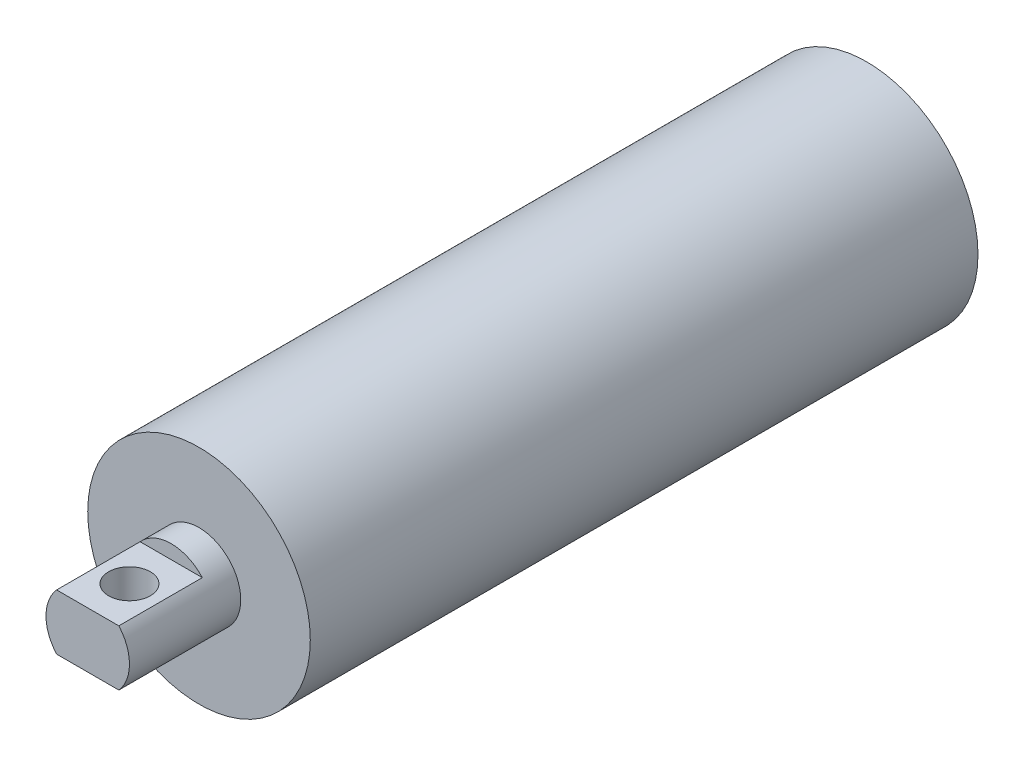
ISO-10303-21;
HEADER;
FILE_DESCRIPTION(('STEP AP214'),'2;1');
FILE_NAME('part.step','',(''),(''),'','','');
FILE_SCHEMA(('AUTOMOTIVE_DESIGN { 1 0 10303 214 1 1 1 1 }'));
ENDSEC;
DATA;
#1=APPLICATION_CONTEXT('core data for automotive mechanical design processes');
#2=APPLICATION_PROTOCOL_DEFINITION('international standard','automotive_design',2000,#1);
#3=PRODUCT_CONTEXT('',#1,'mechanical');
#4=PRODUCT('Part','Part','',(#3));
#5=PRODUCT_RELATED_PRODUCT_CATEGORY('part','',(#4));
#6=PRODUCT_DEFINITION_FORMATION('','',#4);
#7=PRODUCT_DEFINITION_CONTEXT('part definition',#1,'design');
#8=PRODUCT_DEFINITION('design','',#6,#7);
#9=PRODUCT_DEFINITION_SHAPE('','',#8);
#10=(LENGTH_UNIT() NAMED_UNIT(*) SI_UNIT(.MILLI.,.METRE.));
#11=(NAMED_UNIT(*) PLANE_ANGLE_UNIT() SI_UNIT($,.RADIAN.));
#12=(NAMED_UNIT(*) SI_UNIT($,.STERADIAN.) SOLID_ANGLE_UNIT());
#13=UNCERTAINTY_MEASURE_WITH_UNIT(LENGTH_MEASURE(1.E-05),#10,'distance_accuracy_value','');
#14=(GEOMETRIC_REPRESENTATION_CONTEXT(3) GLOBAL_UNCERTAINTY_ASSIGNED_CONTEXT((#13)) GLOBAL_UNIT_ASSIGNED_CONTEXT((#10,
#11,#12)) REPRESENTATION_CONTEXT('',''));
#15=CARTESIAN_POINT('',(0.,0.,0.));
#16=DIRECTION('',(0.,0.,1.));
#17=DIRECTION('',(1.,0.,0.));
#18=AXIS2_PLACEMENT_3D('',#15,#16,#17);
#19=CARTESIAN_POINT('',(0.,0.,152.4));
#20=DIRECTION('',(0.,0.,-1.));
#21=DIRECTION('',(-1.,0.,0.));
#22=AXIS2_PLACEMENT_3D('',#19,#20,#21);
#23=CYLINDRICAL_SURFACE('',#22,25.4);
#24=CARTESIAN_POINT('',(0.,0.,152.4));
#25=DIRECTION('',(0.,0.,1.));
#26=DIRECTION('',(1.,0.,0.));
#27=AXIS2_PLACEMENT_3D('',#24,#25,#26);
#28=CIRCLE('',#27,25.4);
#29=CARTESIAN_POINT('',(-25.4,0.,152.4));
#30=VERTEX_POINT('',#29);
#31=EDGE_CURVE('E114',#30,#30,#28,.T.);
#32=CARTESIAN_POINT('',(0.,0.,0.));
#33=DIRECTION('',(0.,0.,1.));
#34=DIRECTION('',(1.,0.,0.));
#35=AXIS2_PLACEMENT_3D('',#32,#33,#34);
#36=CIRCLE('',#35,25.4);
#37=CARTESIAN_POINT('',(-25.4,0.,0.));
#38=VERTEX_POINT('',#37);
#39=EDGE_CURVE('E108',#38,#38,#36,.T.);
#40=CARTESIAN_POINT('',(-25.4,0.,152.4));
#41=CARTESIAN_POINT('',(-25.4,0.,150.8125));
#42=CARTESIAN_POINT('',(-25.4,0.,149.225));
#43=CARTESIAN_POINT('',(-25.4,0.,146.05));
#44=CARTESIAN_POINT('',(-25.4,0.,144.4625));
#45=CARTESIAN_POINT('',(-25.4,0.,141.2875));
#46=CARTESIAN_POINT('',(-25.4,0.,139.7));
#47=CARTESIAN_POINT('',(-25.4,0.,136.525));
#48=CARTESIAN_POINT('',(-25.4,0.,134.9375));
#49=CARTESIAN_POINT('',(-25.4,0.,131.7625));
#50=CARTESIAN_POINT('',(-25.4,0.,130.175));
#51=CARTESIAN_POINT('',(-25.4,0.,127.));
#52=CARTESIAN_POINT('',(-25.4,0.,125.4125));
#53=CARTESIAN_POINT('',(-25.4,0.,122.2375));
#54=CARTESIAN_POINT('',(-25.4,0.,120.65));
#55=CARTESIAN_POINT('',(-25.4,0.,117.475));
#56=CARTESIAN_POINT('',(-25.4,0.,115.8875));
#57=CARTESIAN_POINT('',(-25.4,0.,112.7125));
#58=CARTESIAN_POINT('',(-25.4,0.,111.125));
#59=CARTESIAN_POINT('',(-25.4,0.,107.95));
#60=CARTESIAN_POINT('',(-25.4,0.,106.3625));
#61=CARTESIAN_POINT('',(-25.4,0.,103.1875));
#62=CARTESIAN_POINT('',(-25.4,0.,101.6));
#63=CARTESIAN_POINT('',(-25.4,0.,98.425));
#64=CARTESIAN_POINT('',(-25.4,0.,96.8375));
#65=CARTESIAN_POINT('',(-25.4,0.,93.6625));
#66=CARTESIAN_POINT('',(-25.4,0.,92.075));
#67=CARTESIAN_POINT('',(-25.4,0.,88.9));
#68=CARTESIAN_POINT('',(-25.4,0.,87.3125));
#69=CARTESIAN_POINT('',(-25.4,0.,84.1375));
#70=CARTESIAN_POINT('',(-25.4,0.,82.55));
#71=CARTESIAN_POINT('',(-25.4,0.,79.375));
#72=CARTESIAN_POINT('',(-25.4,0.,77.7875));
#73=CARTESIAN_POINT('',(-25.4,0.,74.6125));
#74=CARTESIAN_POINT('',(-25.4,0.,73.025));
#75=CARTESIAN_POINT('',(-25.4,0.,69.85));
#76=CARTESIAN_POINT('',(-25.4,0.,68.2625));
#77=CARTESIAN_POINT('',(-25.4,0.,65.0875));
#78=CARTESIAN_POINT('',(-25.4,0.,63.5));
#79=CARTESIAN_POINT('',(-25.4,0.,60.325));
#80=CARTESIAN_POINT('',(-25.4,0.,58.7375));
#81=CARTESIAN_POINT('',(-25.4,0.,55.5625));
#82=CARTESIAN_POINT('',(-25.4,0.,53.975));
#83=CARTESIAN_POINT('',(-25.4,0.,50.8));
#84=CARTESIAN_POINT('',(-25.4,0.,49.2125));
#85=CARTESIAN_POINT('',(-25.4,0.,46.0375));
#86=CARTESIAN_POINT('',(-25.4,0.,44.45));
#87=CARTESIAN_POINT('',(-25.4,0.,41.275));
#88=CARTESIAN_POINT('',(-25.4,0.,39.6875));
#89=CARTESIAN_POINT('',(-25.4,0.,36.5125));
#90=CARTESIAN_POINT('',(-25.4,0.,34.925));
#91=CARTESIAN_POINT('',(-25.4,0.,31.75));
#92=CARTESIAN_POINT('',(-25.4,0.,30.1625));
#93=CARTESIAN_POINT('',(-25.4,0.,26.9875));
#94=CARTESIAN_POINT('',(-25.4,0.,25.4));
#95=CARTESIAN_POINT('',(-25.4,0.,22.225));
#96=CARTESIAN_POINT('',(-25.4,0.,20.6375));
#97=CARTESIAN_POINT('',(-25.4,0.,17.4625));
#98=CARTESIAN_POINT('',(-25.4,0.,15.875));
#99=CARTESIAN_POINT('',(-25.4,0.,12.7));
#100=CARTESIAN_POINT('',(-25.4,0.,11.1125));
#101=CARTESIAN_POINT('',(-25.4,0.,7.93750000000001));
#102=CARTESIAN_POINT('',(-25.4,0.,6.35));
#103=CARTESIAN_POINT('',(-25.4,0.,3.175));
#104=CARTESIAN_POINT('',(-25.4,0.,1.5875));
#105=CARTESIAN_POINT('',(-25.4,0.,0.));
#106=B_SPLINE_CURVE_WITH_KNOTS('',3,(#40,#41,#42,#43,#44,#45,#46,#47,#48,#49,#50,#51,#52,#53,
#54,#55,#56,#57,#58,#59,#60,#61,#62,#63,#64,#65,#66,#67,#68,#69,#70,#71,#72,#73,#74,#75,#76,#77,
#78,#79,#80,#81,#82,#83,#84,#85,#86,#87,#88,#89,#90,#91,#92,#93,#94,#95,#96,#97,#98,#99,#100,
#101,#102,#103,#104,#105),.UNSPECIFIED.,.F.,.F.,(4,2,2,2,2,2,2,2,2,2,2,2,2,2,2,2,2,2,2,2,2,2,2,
2,2,2,2,2,2,2,2,2,4),(0.,4.76249999999998,9.52499999999998,14.2875,19.05,23.8125,28.575,33.3375,
38.1,42.8625,47.625,52.3875,57.15,61.9125,66.675,71.4375,76.2,80.9625,85.725,90.4875,95.25,
100.0125,104.775,109.5375,114.3,119.0625,123.825,128.5875,133.35,138.1125,142.875,147.6375,
152.4),.UNSPECIFIED.);
#107=EDGE_CURVE('BSEAM43',#30,#38,#106,.T.);
#108=ORIENTED_EDGE('',*,*,#31,.F.);
#109=ORIENTED_EDGE('',*,*,#39,.T.);
#110=ORIENTED_EDGE('',*,*,#107,.T.);
#111=ORIENTED_EDGE('',*,*,#107,.F.);
#112=EDGE_LOOP('',(#108,#110,#109,#111));
#113=FACE_BOUND('',#112,.T.);
#114=ADVANCED_FACE('F43',(#113),#23,.T.);
#115=CARTESIAN_POINT('',(0.,0.,152.4));
#116=DIRECTION('',(0.,0.,1.));
#117=DIRECTION('',(1.,0.,0.));
#118=AXIS2_PLACEMENT_3D('',#115,#116,#117);
#119=PLANE('',#118);
#120=CARTESIAN_POINT('',(0.,0.,152.4));
#121=DIRECTION('',(0.,0.,1.));
#122=DIRECTION('',(1.,0.,0.));
#123=AXIS2_PLACEMENT_3D('',#120,#121,#122);
#124=CIRCLE('',#123,9.525);
#125=CARTESIAN_POINT('',(9.525,0.,152.4));
#126=VERTEX_POINT('',#125);
#127=EDGE_CURVE('E95',#126,#126,#124,.T.);
#128=ORIENTED_EDGE('',*,*,#127,.F.);
#129=EDGE_LOOP('',(#128));
#130=FACE_BOUND('',#129,.T.);
#131=ORIENTED_EDGE('',*,*,#31,.T.);
#132=EDGE_LOOP('',(#131));
#133=FACE_BOUND('',#132,.T.);
#134=ADVANCED_FACE('F153',(#130,#133),#119,.T.);
#135=CARTESIAN_POINT('',(0.,0.,0.));
#136=DIRECTION('',(0.,0.,1.));
#137=DIRECTION('',(1.,0.,0.));
#138=AXIS2_PLACEMENT_3D('',#135,#136,#137);
#139=PLANE('',#138);
#140=CARTESIAN_POINT('',(0.,0.,0.));
#141=DIRECTION('',(0.,0.,-1.));
#142=DIRECTION('',(-1.,0.,0.));
#143=AXIS2_PLACEMENT_3D('',#140,#141,#142);
#144=CIRCLE('',#143,6.35);
#145=CARTESIAN_POINT('',(-6.35,0.,0.));
#146=VERTEX_POINT('',#145);
#147=EDGE_CURVE('E119',#146,#146,#144,.T.);
#148=ORIENTED_EDGE('',*,*,#147,.F.);
#149=EDGE_LOOP('',(#148));
#150=FACE_BOUND('',#149,.T.);
#151=ORIENTED_EDGE('',*,*,#39,.F.);
#152=EDGE_LOOP('',(#151));
#153=FACE_BOUND('',#152,.T.);
#154=ADVANCED_FACE('F150',(#150,#153),#139,.F.);
#155=CARTESIAN_POINT('',(0.,0.,177.8));
#156=DIRECTION('',(0.,0.,-1.));
#157=DIRECTION('',(-1.,0.,0.));
#158=AXIS2_PLACEMENT_3D('',#155,#156,#157);
#159=CYLINDRICAL_SURFACE('',#158,9.525);
#160=CARTESIAN_POINT('',(0.,0.,177.8));
#161=DIRECTION('',(0.,0.,1.));
#162=DIRECTION('',(1.,0.,0.));
#163=AXIS2_PLACEMENT_3D('',#160,#161,#162);
#164=CIRCLE('',#163,9.525);
#165=CARTESIAN_POINT('',(-7.09951582856183,6.35,177.8));
#166=VERTEX_POINT('',#165);
#167=CARTESIAN_POINT('',(-7.09951582856183,-6.35,177.8));
#168=VERTEX_POINT('',#167);
#169=EDGE_CURVE('E102',#166,#168,#164,.T.);
#170=ORIENTED_EDGE('',*,*,#169,.F.);
#171=DIRECTION('',(0.,0.,-1.));
#172=VECTOR('',#171,1.);
#173=CARTESIAN_POINT('',(-7.09951582856183,6.35,177.8));
#174=LINE('',#173,#172);
#175=CARTESIAN_POINT('',(-7.09951582856183,6.35,158.75));
#176=VERTEX_POINT('',#175);
#177=EDGE_CURVE('E67',#166,#176,#174,.T.);
#178=ORIENTED_EDGE('',*,*,#177,.T.);
#179=CARTESIAN_POINT('',(0.,0.,158.75));
#180=DIRECTION('',(0.,0.,-1.));
#181=DIRECTION('',(-1.,0.,0.));
#182=AXIS2_PLACEMENT_3D('',#179,#180,#181);
#183=CIRCLE('',#182,9.525);
#184=CARTESIAN_POINT('',(7.09951582856183,6.35,158.75));
#185=VERTEX_POINT('',#184);
#186=EDGE_CURVE('E11',#176,#185,#183,.T.);
#187=ORIENTED_EDGE('',*,*,#186,.T.);
#188=DIRECTION('',(0.,0.,-1.));
#189=VECTOR('',#188,1.);
#190=CARTESIAN_POINT('',(7.09951582856183,6.35,177.8));
#191=LINE('',#190,#189);
#192=CARTESIAN_POINT('',(7.09951582856183,6.35,177.8));
#193=VERTEX_POINT('',#192);
#194=EDGE_CURVE('E132',#185,#193,#191,.F.);
#195=ORIENTED_EDGE('',*,*,#194,.T.);
#196=CARTESIAN_POINT('',(7.09951582856183,-6.35,177.8));
#197=VERTEX_POINT('',#196);
#198=EDGE_CURVE('E109',#197,#193,#164,.T.);
#199=ORIENTED_EDGE('',*,*,#198,.F.);
#200=DIRECTION('',(0.,0.,-1.));
#201=VECTOR('',#200,1.);
#202=CARTESIAN_POINT('',(7.09951582856183,-6.35,177.8));
#203=LINE('',#202,#201);
#204=CARTESIAN_POINT('',(7.09951582856183,-6.35,158.75));
#205=VERTEX_POINT('',#204);
#206=EDGE_CURVE('E59',#197,#205,#203,.T.);
#207=ORIENTED_EDGE('',*,*,#206,.T.);
#208=CARTESIAN_POINT('',(0.,0.,158.75));
#209=DIRECTION('',(0.,0.,-1.));
#210=DIRECTION('',(-1.,0.,0.));
#211=AXIS2_PLACEMENT_3D('',#208,#209,#210);
#212=CIRCLE('',#211,9.525);
#213=CARTESIAN_POINT('',(-7.09951582856183,-6.35,158.75));
#214=VERTEX_POINT('',#213);
#215=EDGE_CURVE('E52',#205,#214,#212,.T.);
#216=ORIENTED_EDGE('',*,*,#215,.T.);
#217=DIRECTION('',(0.,0.,-1.));
#218=VECTOR('',#217,1.);
#219=CARTESIAN_POINT('',(-7.09951582856183,-6.35,177.8));
#220=LINE('',#219,#218);
#221=EDGE_CURVE('E87',#214,#168,#220,.F.);
#222=ORIENTED_EDGE('',*,*,#221,.T.);
#223=EDGE_LOOP('',(#170,#178,#187,#195,#199,#207,#216,#222));
#224=FACE_BOUND('',#223,.T.);
#225=ORIENTED_EDGE('',*,*,#127,.T.);
#226=EDGE_LOOP('',(#225));
#227=FACE_BOUND('',#226,.T.);
#228=ADVANCED_FACE('F100',(#224,#227),#159,.T.);
#229=CARTESIAN_POINT('',(0.,0.,177.8));
#230=DIRECTION('',(0.,0.,1.));
#231=DIRECTION('',(1.,0.,0.));
#232=AXIS2_PLACEMENT_3D('',#229,#230,#231);
#233=PLANE('',#232);
#234=DIRECTION('',(1.,0.,0.));
#235=VECTOR('',#234,1.);
#236=CARTESIAN_POINT('',(0.,6.35,177.8));
#237=LINE('',#236,#235);
#238=EDGE_CURVE('E94',#166,#193,#237,.T.);
#239=ORIENTED_EDGE('',*,*,#238,.F.);
#240=ORIENTED_EDGE('',*,*,#169,.T.);
#241=DIRECTION('',(-1.,0.,0.));
#242=VECTOR('',#241,1.);
#243=CARTESIAN_POINT('',(0.,-6.35,177.8));
#244=LINE('',#243,#242);
#245=EDGE_CURVE('E84',#197,#168,#244,.T.);
#246=ORIENTED_EDGE('',*,*,#245,.F.);
#247=ORIENTED_EDGE('',*,*,#198,.T.);
#248=EDGE_LOOP('',(#239,#240,#246,#247));
#249=FACE_BOUND('',#248,.T.);
#250=ADVANCED_FACE('F106',(#249),#233,.T.);
#251=CARTESIAN_POINT('',(0.,0.,100.33));
#252=DIRECTION('',(0.,0.,-1.));
#253=DIRECTION('',(-1.,0.,0.));
#254=AXIS2_PLACEMENT_3D('',#251,#252,#253);
#255=CYLINDRICAL_SURFACE('',#254,6.35);
#256=CARTESIAN_POINT('',(0.,0.,100.33));
#257=DIRECTION('',(0.,0.,-1.));
#258=DIRECTION('',(-1.,0.,0.));
#259=AXIS2_PLACEMENT_3D('',#256,#257,#258);
#260=CIRCLE('',#259,6.35);
#261=CARTESIAN_POINT('',(-6.35,0.,100.33));
#262=VERTEX_POINT('',#261);
#263=EDGE_CURVE('E116',#262,#262,#260,.T.);
#264=ORIENTED_EDGE('',*,*,#263,.F.);
#265=EDGE_LOOP('',(#264));
#266=FACE_BOUND('',#265,.T.);
#267=ORIENTED_EDGE('',*,*,#147,.T.);
#268=EDGE_LOOP('',(#267));
#269=FACE_BOUND('',#268,.T.);
#270=ADVANCED_FACE('F148',(#266,#269),#255,.F.);
#271=CARTESIAN_POINT('',(0.,0.,100.33));
#272=DIRECTION('',(0.,0.,-1.));
#273=DIRECTION('',(-1.,0.,0.));
#274=AXIS2_PLACEMENT_3D('',#271,#272,#273);
#275=PLANE('',#274);
#276=ORIENTED_EDGE('',*,*,#263,.T.);
#277=EDGE_LOOP('',(#276));
#278=FACE_BOUND('',#277,.T.);
#279=ADVANCED_FACE('F175',(#278),#275,.T.);
#280=CARTESIAN_POINT('',(-25.4,-9.525,158.75));
#281=DIRECTION('',(0.,0.,-1.));
#282=DIRECTION('',(-1.,0.,0.));
#283=AXIS2_PLACEMENT_3D('',#280,#281,#282);
#284=PLANE('',#283);
#285=DIRECTION('',(1.,0.,0.));
#286=VECTOR('',#285,1.);
#287=CARTESIAN_POINT('',(-25.4,-6.35,158.75));
#288=LINE('',#287,#286);
#289=EDGE_CURVE('E205',#214,#205,#288,.T.);
#290=ORIENTED_EDGE('',*,*,#289,.F.);
#291=ORIENTED_EDGE('',*,*,#215,.F.);
#292=EDGE_LOOP('',(#290,#291));
#293=FACE_BOUND('',#292,.T.);
#294=ADVANCED_FACE('F179',(#293),#284,.F.);
#295=CARTESIAN_POINT('',(-25.4,-6.35,177.8));
#296=DIRECTION('',(0.,1.,0.));
#297=DIRECTION('',(0.,0.,1.));
#298=AXIS2_PLACEMENT_3D('',#295,#296,#297);
#299=PLANE('',#298);
#300=CARTESIAN_POINT('',(0.,-6.35,168.275));
#301=DIRECTION('',(0.,-1.,0.));
#302=DIRECTION('',(0.,0.,-1.));
#303=AXIS2_PLACEMENT_3D('',#300,#301,#302);
#304=CIRCLE('',#303,4.76249999999999);
#305=CARTESIAN_POINT('',(0.,-6.35,163.5125));
#306=VERTEX_POINT('',#305);
#307=EDGE_CURVE('E201',#306,#306,#304,.T.);
#308=ORIENTED_EDGE('',*,*,#307,.F.);
#309=EDGE_LOOP('',(#308));
#310=FACE_BOUND('',#309,.T.);
#311=ORIENTED_EDGE('',*,*,#245,.T.);
#312=ORIENTED_EDGE('',*,*,#221,.F.);
#313=ORIENTED_EDGE('',*,*,#289,.T.);
#314=ORIENTED_EDGE('',*,*,#206,.F.);
#315=EDGE_LOOP('',(#311,#312,#313,#314));
#316=FACE_BOUND('',#315,.T.);
#317=ADVANCED_FACE('F86',(#310,#316),#299,.F.);
#318=CARTESIAN_POINT('',(-25.4,9.525,158.75));
#319=DIRECTION('',(0.,0.,-1.));
#320=DIRECTION('',(-1.,0.,0.));
#321=AXIS2_PLACEMENT_3D('',#318,#319,#320);
#322=PLANE('',#321);
#323=DIRECTION('',(1.,0.,0.));
#324=VECTOR('',#323,1.);
#325=CARTESIAN_POINT('',(-25.4,6.35,158.75));
#326=LINE('',#325,#324);
#327=EDGE_CURVE('E104',#176,#185,#326,.T.);
#328=ORIENTED_EDGE('',*,*,#327,.T.);
#329=ORIENTED_EDGE('',*,*,#186,.F.);
#330=EDGE_LOOP('',(#328,#329));
#331=FACE_BOUND('',#330,.T.);
#332=ADVANCED_FACE('F182',(#331),#322,.F.);
#333=CARTESIAN_POINT('',(-25.4,6.35,177.8));
#334=DIRECTION('',(0.,-1.,0.));
#335=DIRECTION('',(0.,0.,-1.));
#336=AXIS2_PLACEMENT_3D('',#333,#334,#335);
#337=PLANE('',#336);
#338=CARTESIAN_POINT('',(0.,6.35,168.275));
#339=DIRECTION('',(0.,-1.,0.));
#340=DIRECTION('',(0.,0.,-1.));
#341=AXIS2_PLACEMENT_3D('',#338,#339,#340);
#342=CIRCLE('',#341,4.76249999999999);
#343=CARTESIAN_POINT('',(0.,6.35,163.5125));
#344=VERTEX_POINT('',#343);
#345=EDGE_CURVE('E46',#344,#344,#342,.T.);
#346=ORIENTED_EDGE('',*,*,#345,.T.);
#347=EDGE_LOOP('',(#346));
#348=FACE_BOUND('',#347,.T.);
#349=ORIENTED_EDGE('',*,*,#238,.T.);
#350=ORIENTED_EDGE('',*,*,#194,.F.);
#351=ORIENTED_EDGE('',*,*,#327,.F.);
#352=ORIENTED_EDGE('',*,*,#177,.F.);
#353=EDGE_LOOP('',(#349,#350,#351,#352));
#354=FACE_BOUND('',#353,.T.);
#355=ADVANCED_FACE('F131',(#348,#354),#337,.F.);
#356=CARTESIAN_POINT('',(0.,25.4,168.275));
#357=DIRECTION('',(0.,-1.,0.));
#358=DIRECTION('',(0.,0.,-1.));
#359=AXIS2_PLACEMENT_3D('',#356,#357,#358);
#360=CYLINDRICAL_SURFACE('',#359,4.76249999999999);
#361=ORIENTED_EDGE('',*,*,#307,.T.);
#362=EDGE_LOOP('',(#361));
#363=FACE_BOUND('',#362,.T.);
#364=ORIENTED_EDGE('',*,*,#345,.F.);
#365=EDGE_LOOP('',(#364));
#366=FACE_BOUND('',#365,.T.);
#367=ADVANCED_FACE('F189',(#363,#366),#360,.F.);
#368=CLOSED_SHELL('',(#114,#134,#154,#228,#250,#270,#279,#294,#317,#332,#355,#367));
#369=MANIFOLD_SOLID_BREP('B2',#368);
#370=ADVANCED_BREP_SHAPE_REPRESENTATION('',(#18,#369),#14);
#371=SHAPE_DEFINITION_REPRESENTATION(#9,#370);
ENDSEC;
END-ISO-10303-21;
